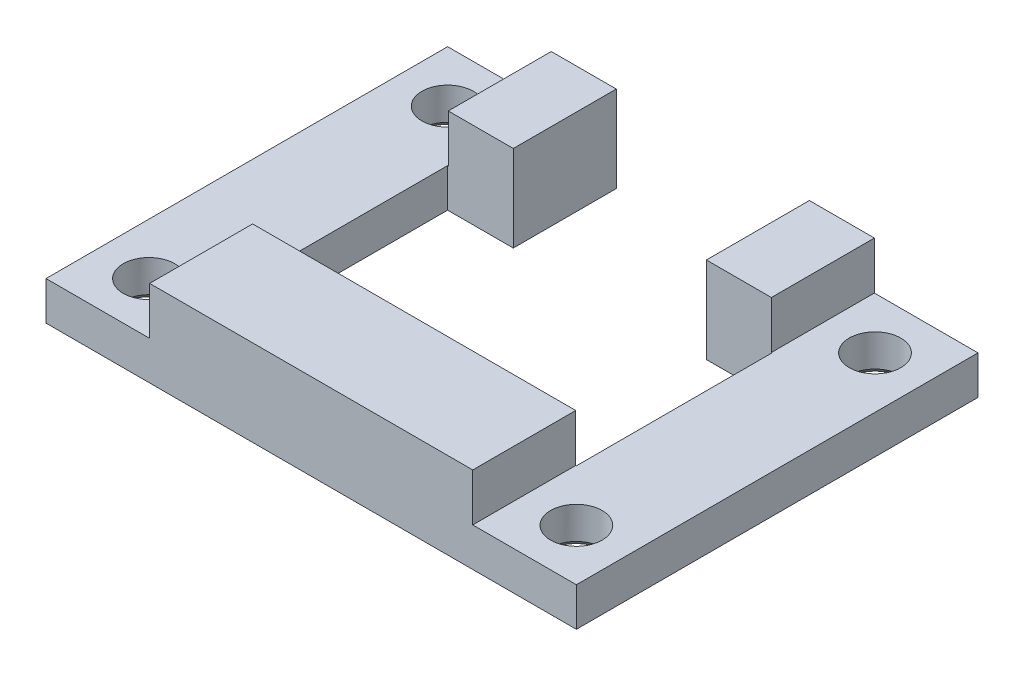
ISO-10303-21;
HEADER;
FILE_DESCRIPTION(('STEP AP214'),'2;1');
FILE_NAME('part.step','',(''),(''),'','','');
FILE_SCHEMA(('AUTOMOTIVE_DESIGN { 1 0 10303 214 1 1 1 1 }'));
ENDSEC;
DATA;
#1=APPLICATION_CONTEXT('core data for automotive mechanical design processes');
#2=APPLICATION_PROTOCOL_DEFINITION('international standard','automotive_design',2000,#1);
#3=PRODUCT_CONTEXT('',#1,'mechanical');
#4=PRODUCT('Part','Part','',(#3));
#5=PRODUCT_RELATED_PRODUCT_CATEGORY('part','',(#4));
#6=PRODUCT_DEFINITION_FORMATION('','',#4);
#7=PRODUCT_DEFINITION_CONTEXT('part definition',#1,'design');
#8=PRODUCT_DEFINITION('design','',#6,#7);
#9=PRODUCT_DEFINITION_SHAPE('','',#8);
#10=(LENGTH_UNIT() NAMED_UNIT(*) SI_UNIT(.MILLI.,.METRE.));
#11=(NAMED_UNIT(*) PLANE_ANGLE_UNIT() SI_UNIT($,.RADIAN.));
#12=(NAMED_UNIT(*) SI_UNIT($,.STERADIAN.) SOLID_ANGLE_UNIT());
#13=UNCERTAINTY_MEASURE_WITH_UNIT(LENGTH_MEASURE(1.E-05),#10,'distance_accuracy_value','');
#14=(GEOMETRIC_REPRESENTATION_CONTEXT(3) GLOBAL_UNCERTAINTY_ASSIGNED_CONTEXT((#13)) GLOBAL_UNIT_ASSIGNED_CONTEXT((#10,
#11,#12)) REPRESENTATION_CONTEXT('',''));
#15=CARTESIAN_POINT('',(0.,0.,0.));
#16=DIRECTION('',(0.,0.,1.));
#17=DIRECTION('',(1.,0.,0.));
#18=AXIS2_PLACEMENT_3D('',#15,#16,#17);
#19=CARTESIAN_POINT('',(-20.6,3.,-15.6));
#20=DIRECTION('',(0.,0.,1.));
#21=DIRECTION('',(1.,0.,0.));
#22=AXIS2_PLACEMENT_3D('',#19,#20,#21);
#23=PLANE('',#22);
#24=DIRECTION('',(-1.,0.,0.));
#25=VECTOR('',#24,1.);
#26=CARTESIAN_POINT('',(12.55,6.7,-15.6));
#27=LINE('',#26,#25);
#28=CARTESIAN_POINT('',(-7.5,6.7,-15.6));
#29=VERTEX_POINT('',#28);
#30=CARTESIAN_POINT('',(-12.55,6.7,-15.6));
#31=VERTEX_POINT('',#30);
#32=EDGE_CURVE('E201',#29,#31,#27,.T.);
#33=ORIENTED_EDGE('',*,*,#32,.F.);
#34=DIRECTION('',(0.,-1.,0.));
#35=VECTOR('',#34,1.);
#36=CARTESIAN_POINT('',(-7.5,40.9531750353161,-15.6));
#37=LINE('',#36,#35);
#38=CARTESIAN_POINT('',(-7.5,0.,-15.6));
#39=VERTEX_POINT('',#38);
#40=EDGE_CURVE('E184',#29,#39,#37,.T.);
#41=ORIENTED_EDGE('',*,*,#40,.T.);
#42=DIRECTION('',(-1.,0.,0.));
#43=VECTOR('',#42,1.);
#44=CARTESIAN_POINT('',(-20.6,0.,-15.6));
#45=LINE('',#44,#43);
#46=CARTESIAN_POINT('',(-20.6,0.,-15.6));
#47=VERTEX_POINT('',#46);
#48=EDGE_CURVE('E198',#39,#47,#45,.T.);
#49=ORIENTED_EDGE('',*,*,#48,.T.);
#50=DIRECTION('',(0.,-1.,0.));
#51=VECTOR('',#50,1.);
#52=CARTESIAN_POINT('',(-20.6,3.,-15.6));
#53=LINE('',#52,#51);
#54=CARTESIAN_POINT('',(-20.6,3.,-15.6));
#55=VERTEX_POINT('',#54);
#56=EDGE_CURVE('E237',#55,#47,#53,.T.);
#57=ORIENTED_EDGE('',*,*,#56,.F.);
#58=DIRECTION('',(-1.,0.,0.));
#59=VECTOR('',#58,1.);
#60=CARTESIAN_POINT('',(-20.6,3.,-15.6));
#61=LINE('',#60,#59);
#62=CARTESIAN_POINT('',(-12.55,3.,-15.6));
#63=VERTEX_POINT('',#62);
#64=EDGE_CURVE('E471',#63,#55,#61,.T.);
#65=ORIENTED_EDGE('',*,*,#64,.F.);
#66=DIRECTION('',(0.,-1.,0.));
#67=VECTOR('',#66,1.);
#68=CARTESIAN_POINT('',(-12.55,6.7,-15.6));
#69=LINE('',#68,#67);
#70=EDGE_CURVE('E461',#31,#63,#69,.T.);
#71=ORIENTED_EDGE('',*,*,#70,.F.);
#72=EDGE_LOOP('',(#33,#41,#49,#57,#65,#71));
#73=FACE_BOUND('',#72,.T.);
#74=ADVANCED_FACE('F42',(#73),#23,.F.);
#75=CARTESIAN_POINT('',(12.55,6.7,-15.6));
#76=DIRECTION('',(-1.,0.,0.));
#77=DIRECTION('',(0.,0.,1.));
#78=AXIS2_PLACEMENT_3D('',#75,#76,#77);
#79=PLANE('',#78);
#80=DIRECTION('',(0.,0.,-1.));
#81=VECTOR('',#80,1.);
#82=CARTESIAN_POINT('',(12.55,3.,-15.6));
#83=LINE('',#82,#81);
#84=CARTESIAN_POINT('',(12.55,3.,15.6));
#85=VERTEX_POINT('',#84);
#86=CARTESIAN_POINT('',(12.55,3.,7.6));
#87=VERTEX_POINT('',#86);
#88=EDGE_CURVE('E67',#85,#87,#83,.T.);
#89=ORIENTED_EDGE('',*,*,#88,.T.);
#90=DIRECTION('',(0.,1.,0.));
#91=VECTOR('',#90,1.);
#92=CARTESIAN_POINT('',(12.55,6.7,7.6));
#93=LINE('',#92,#91);
#94=CARTESIAN_POINT('',(12.55,6.7,7.6));
#95=VERTEX_POINT('',#94);
#96=EDGE_CURVE('E390',#87,#95,#93,.T.);
#97=ORIENTED_EDGE('',*,*,#96,.T.);
#98=DIRECTION('',(0.,0.,-1.));
#99=VECTOR('',#98,1.);
#100=CARTESIAN_POINT('',(12.55,6.7,-15.6));
#101=LINE('',#100,#99);
#102=CARTESIAN_POINT('',(12.55,6.7,15.6));
#103=VERTEX_POINT('',#102);
#104=EDGE_CURVE('E430',#103,#95,#101,.T.);
#105=ORIENTED_EDGE('',*,*,#104,.F.);
#106=DIRECTION('',(0.,-1.,0.));
#107=VECTOR('',#106,1.);
#108=CARTESIAN_POINT('',(12.55,6.7,15.6));
#109=LINE('',#108,#107);
#110=EDGE_CURVE('E446',#103,#85,#109,.T.);
#111=ORIENTED_EDGE('',*,*,#110,.T.);
#112=EDGE_LOOP('',(#89,#97,#105,#111));
#113=FACE_BOUND('',#112,.T.);
#114=ADVANCED_FACE('F302',(#113),#79,.F.);
#115=CARTESIAN_POINT('',(-12.55,6.7,-15.6));
#116=DIRECTION('',(1.,0.,0.));
#117=DIRECTION('',(0.,0.,-1.));
#118=AXIS2_PLACEMENT_3D('',#115,#116,#117);
#119=PLANE('',#118);
#120=DIRECTION('',(0.,0.,1.));
#121=VECTOR('',#120,1.);
#122=CARTESIAN_POINT('',(-12.55,3.,-15.6));
#123=LINE('',#122,#121);
#124=CARTESIAN_POINT('',(-12.55,3.,-7.6));
#125=VERTEX_POINT('',#124);
#126=EDGE_CURVE('E450',#63,#125,#123,.T.);
#127=ORIENTED_EDGE('',*,*,#126,.T.);
#128=DIRECTION('',(0.,1.,0.));
#129=VECTOR('',#128,1.);
#130=CARTESIAN_POINT('',(-12.55,6.7,-7.6));
#131=LINE('',#130,#129);
#132=CARTESIAN_POINT('',(-12.55,6.7,-7.6));
#133=VERTEX_POINT('',#132);
#134=EDGE_CURVE('E397',#125,#133,#131,.T.);
#135=ORIENTED_EDGE('',*,*,#134,.T.);
#136=DIRECTION('',(0.,0.,1.));
#137=VECTOR('',#136,1.);
#138=CARTESIAN_POINT('',(-12.55,6.7,-15.6));
#139=LINE('',#138,#137);
#140=EDGE_CURVE('E439',#31,#133,#139,.T.);
#141=ORIENTED_EDGE('',*,*,#140,.F.);
#142=ORIENTED_EDGE('',*,*,#70,.T.);
#143=EDGE_LOOP('',(#127,#135,#141,#142));
#144=FACE_BOUND('',#143,.T.);
#145=ADVANCED_FACE('F308',(#144),#119,.F.);
#146=CARTESIAN_POINT('',(0.,6.7,0.));
#147=DIRECTION('',(0.,-1.,0.));
#148=DIRECTION('',(0.,0.,-1.));
#149=AXIS2_PLACEMENT_3D('',#146,#147,#148);
#150=PLANE('',#149);
#151=DIRECTION('',(-1.,0.,0.));
#152=VECTOR('',#151,1.);
#153=CARTESIAN_POINT('',(-12.6,6.7,-7.6));
#154=LINE('',#153,#152);
#155=CARTESIAN_POINT('',(-7.5,6.7,-7.6));
#156=VERTEX_POINT('',#155);
#157=EDGE_CURVE('E499',#156,#133,#154,.T.);
#158=ORIENTED_EDGE('',*,*,#157,.F.);
#159=DIRECTION('',(0.,0.,1.));
#160=VECTOR('',#159,1.);
#161=CARTESIAN_POINT('',(-7.5,6.7,-15.6));
#162=LINE('',#161,#160);
#163=EDGE_CURVE('E378',#29,#156,#162,.T.);
#164=ORIENTED_EDGE('',*,*,#163,.F.);
#165=ORIENTED_EDGE('',*,*,#32,.T.);
#166=ORIENTED_EDGE('',*,*,#140,.T.);
#167=EDGE_LOOP('',(#158,#164,#165,#166));
#168=FACE_BOUND('',#167,.T.);
#169=ADVANCED_FACE('F498',(#168),#150,.F.);
#170=ORIENTED_EDGE('',*,*,#104,.T.);
#171=DIRECTION('',(-1.,0.,0.));
#172=VECTOR('',#171,1.);
#173=CARTESIAN_POINT('',(0.,6.7,7.6));
#174=LINE('',#173,#172);
#175=CARTESIAN_POINT('',(-12.55,6.7,7.6));
#176=VERTEX_POINT('',#175);
#177=EDGE_CURVE('E248',#95,#176,#174,.T.);
#178=ORIENTED_EDGE('',*,*,#177,.T.);
#179=CARTESIAN_POINT('',(-12.55,6.7,15.6));
#180=VERTEX_POINT('',#179);
#181=EDGE_CURVE('E438',#176,#180,#139,.T.);
#182=ORIENTED_EDGE('',*,*,#181,.T.);
#183=DIRECTION('',(1.,0.,0.));
#184=VECTOR('',#183,1.);
#185=CARTESIAN_POINT('',(12.55,6.7,15.6));
#186=LINE('',#185,#184);
#187=EDGE_CURVE('E443',#180,#103,#186,.T.);
#188=ORIENTED_EDGE('',*,*,#187,.T.);
#189=EDGE_LOOP('',(#170,#178,#182,#188));
#190=FACE_BOUND('',#189,.T.);
#191=ADVANCED_FACE('F533',(#190),#150,.F.);
#192=CARTESIAN_POINT('',(0.,3.,0.));
#193=DIRECTION('',(0.,-1.,0.));
#194=DIRECTION('',(0.,0.,-1.));
#195=AXIS2_PLACEMENT_3D('',#192,#193,#194);
#196=PLANE('',#195);
#197=CARTESIAN_POINT('',(16.6,3.,-11.6));
#198=DIRECTION('',(0.,1.,0.));
#199=DIRECTION('',(0.,0.,1.));
#200=AXIS2_PLACEMENT_3D('',#197,#198,#199);
#201=CIRCLE('',#200,2.);
#202=CARTESIAN_POINT('',(16.6,3.,-9.6));
#203=VERTEX_POINT('',#202);
#204=EDGE_CURVE('E413',#203,#203,#201,.T.);
#205=ORIENTED_EDGE('',*,*,#204,.F.);
#206=EDGE_LOOP('',(#205));
#207=FACE_BOUND('',#206,.T.);
#208=CARTESIAN_POINT('',(16.6,3.,11.6));
#209=DIRECTION('',(0.,1.,0.));
#210=DIRECTION('',(0.,0.,1.));
#211=AXIS2_PLACEMENT_3D('',#208,#209,#210);
#212=CIRCLE('',#211,2.);
#213=CARTESIAN_POINT('',(16.6,3.,13.6));
#214=VERTEX_POINT('',#213);
#215=EDGE_CURVE('E418',#214,#214,#212,.T.);
#216=ORIENTED_EDGE('',*,*,#215,.F.);
#217=EDGE_LOOP('',(#216));
#218=FACE_BOUND('',#217,.T.);
#219=DIRECTION('',(0.,0.,1.));
#220=VECTOR('',#219,1.);
#221=CARTESIAN_POINT('',(12.6,3.,0.));
#222=LINE('',#221,#220);
#223=CARTESIAN_POINT('',(12.6,3.,-7.6));
#224=VERTEX_POINT('',#223);
#225=CARTESIAN_POINT('',(12.6,3.,7.6));
#226=VERTEX_POINT('',#225);
#227=EDGE_CURVE('E405',#224,#226,#222,.T.);
#228=ORIENTED_EDGE('',*,*,#227,.T.);
#229=DIRECTION('',(-1.,0.,0.));
#230=VECTOR('',#229,1.);
#231=CARTESIAN_POINT('',(0.,3.,7.6));
#232=LINE('',#231,#230);
#233=EDGE_CURVE('E394',#226,#87,#232,.T.);
#234=ORIENTED_EDGE('',*,*,#233,.T.);
#235=ORIENTED_EDGE('',*,*,#88,.F.);
#236=DIRECTION('',(1.,0.,0.));
#237=VECTOR('',#236,1.);
#238=CARTESIAN_POINT('',(-20.6,3.,15.6));
#239=LINE('',#238,#237);
#240=CARTESIAN_POINT('',(20.6,3.,15.6));
#241=VERTEX_POINT('',#240);
#242=EDGE_CURVE('E478',#85,#241,#239,.T.);
#243=ORIENTED_EDGE('',*,*,#242,.T.);
#244=DIRECTION('',(0.,0.,-1.));
#245=VECTOR('',#244,1.);
#246=CARTESIAN_POINT('',(20.6,3.,15.6));
#247=LINE('',#246,#245);
#248=CARTESIAN_POINT('',(20.6,3.,-15.6));
#249=VERTEX_POINT('',#248);
#250=EDGE_CURVE('E227',#241,#249,#247,.T.);
#251=ORIENTED_EDGE('',*,*,#250,.T.);
#252=CARTESIAN_POINT('',(12.55,3.,-15.6));
#253=VERTEX_POINT('',#252);
#254=EDGE_CURVE('E472',#249,#253,#61,.T.);
#255=ORIENTED_EDGE('',*,*,#254,.T.);
#256=CARTESIAN_POINT('',(12.55,3.,-7.6));
#257=VERTEX_POINT('',#256);
#258=EDGE_CURVE('E429',#257,#253,#83,.T.);
#259=ORIENTED_EDGE('',*,*,#258,.F.);
#260=DIRECTION('',(1.,0.,0.));
#261=VECTOR('',#260,1.);
#262=CARTESIAN_POINT('',(0.,3.,-7.6));
#263=LINE('',#262,#261);
#264=EDGE_CURVE('E377',#257,#224,#263,.T.);
#265=ORIENTED_EDGE('',*,*,#264,.T.);
#266=EDGE_LOOP('',(#228,#234,#235,#243,#251,#255,#259,#265));
#267=FACE_BOUND('',#266,.T.);
#268=ADVANCED_FACE('F486',(#207,#218,#267),#196,.F.);
#269=CARTESIAN_POINT('',(-16.6,3.,11.6));
#270=DIRECTION('',(0.,1.,0.));
#271=DIRECTION('',(0.,0.,1.));
#272=AXIS2_PLACEMENT_3D('',#269,#270,#271);
#273=CIRCLE('',#272,2.);
#274=CARTESIAN_POINT('',(-16.6,3.,13.6));
#275=VERTEX_POINT('',#274);
#276=EDGE_CURVE('E419',#275,#275,#273,.T.);
#277=ORIENTED_EDGE('',*,*,#276,.F.);
#278=EDGE_LOOP('',(#277));
#279=FACE_BOUND('',#278,.T.);
#280=CARTESIAN_POINT('',(-16.6,3.,-11.6));
#281=DIRECTION('',(0.,1.,0.));
#282=DIRECTION('',(0.,0.,1.));
#283=AXIS2_PLACEMENT_3D('',#280,#281,#282);
#284=CIRCLE('',#283,2.);
#285=CARTESIAN_POINT('',(-16.6,3.,-9.6));
#286=VERTEX_POINT('',#285);
#287=EDGE_CURVE('E414',#286,#286,#284,.T.);
#288=ORIENTED_EDGE('',*,*,#287,.F.);
#289=EDGE_LOOP('',(#288));
#290=FACE_BOUND('',#289,.T.);
#291=DIRECTION('',(0.,0.,-1.));
#292=VECTOR('',#291,1.);
#293=CARTESIAN_POINT('',(-12.6,3.,0.));
#294=LINE('',#293,#292);
#295=CARTESIAN_POINT('',(-12.6,3.,7.6));
#296=VERTEX_POINT('',#295);
#297=CARTESIAN_POINT('',(-12.6,3.,-7.6));
#298=VERTEX_POINT('',#297);
#299=EDGE_CURVE('E409',#296,#298,#294,.T.);
#300=ORIENTED_EDGE('',*,*,#299,.T.);
#301=DIRECTION('',(1.,0.,0.));
#302=VECTOR('',#301,1.);
#303=CARTESIAN_POINT('',(0.,3.,-7.6));
#304=LINE('',#303,#302);
#305=EDGE_CURVE('E401',#298,#125,#304,.T.);
#306=ORIENTED_EDGE('',*,*,#305,.T.);
#307=ORIENTED_EDGE('',*,*,#126,.F.);
#308=ORIENTED_EDGE('',*,*,#64,.T.);
#309=DIRECTION('',(0.,0.,1.));
#310=VECTOR('',#309,1.);
#311=CARTESIAN_POINT('',(-20.6,3.,15.6));
#312=LINE('',#311,#310);
#313=CARTESIAN_POINT('',(-20.6,3.,15.6));
#314=VERTEX_POINT('',#313);
#315=EDGE_CURVE('E476',#55,#314,#312,.T.);
#316=ORIENTED_EDGE('',*,*,#315,.T.);
#317=CARTESIAN_POINT('',(-12.55,3.,15.6));
#318=VERTEX_POINT('',#317);
#319=EDGE_CURVE('E233',#314,#318,#239,.T.);
#320=ORIENTED_EDGE('',*,*,#319,.T.);
#321=CARTESIAN_POINT('',(-12.55,3.,7.6));
#322=VERTEX_POINT('',#321);
#323=EDGE_CURVE('E449',#322,#318,#123,.T.);
#324=ORIENTED_EDGE('',*,*,#323,.F.);
#325=DIRECTION('',(-1.,0.,0.));
#326=VECTOR('',#325,1.);
#327=CARTESIAN_POINT('',(0.,3.,7.6));
#328=LINE('',#327,#326);
#329=EDGE_CURVE('E386',#322,#296,#328,.T.);
#330=ORIENTED_EDGE('',*,*,#329,.T.);
#331=EDGE_LOOP('',(#300,#306,#307,#308,#316,#320,#324,#330));
#332=FACE_BOUND('',#331,.T.);
#333=ADVANCED_FACE('F322',(#279,#290,#332),#196,.F.);
#334=CARTESIAN_POINT('',(20.6,3.,15.6));
#335=DIRECTION('',(-1.,0.,0.));
#336=DIRECTION('',(0.,0.,1.));
#337=AXIS2_PLACEMENT_3D('',#334,#335,#336);
#338=PLANE('',#337);
#339=DIRECTION('',(0.,0.,-1.));
#340=VECTOR('',#339,1.);
#341=CARTESIAN_POINT('',(20.6,0.,15.6));
#342=LINE('',#341,#340);
#343=CARTESIAN_POINT('',(20.6,0.,15.6));
#344=VERTEX_POINT('',#343);
#345=CARTESIAN_POINT('',(20.6,0.,-15.6));
#346=VERTEX_POINT('',#345);
#347=EDGE_CURVE('E212',#344,#346,#342,.T.);
#348=ORIENTED_EDGE('',*,*,#347,.T.);
#349=DIRECTION('',(0.,-1.,0.));
#350=VECTOR('',#349,1.);
#351=CARTESIAN_POINT('',(20.6,3.,-15.6));
#352=LINE('',#351,#350);
#353=EDGE_CURVE('E240',#249,#346,#352,.T.);
#354=ORIENTED_EDGE('',*,*,#353,.F.);
#355=ORIENTED_EDGE('',*,*,#250,.F.);
#356=DIRECTION('',(0.,-1.,0.));
#357=VECTOR('',#356,1.);
#358=CARTESIAN_POINT('',(20.6,3.,15.6));
#359=LINE('',#358,#357);
#360=EDGE_CURVE('E228',#241,#344,#359,.T.);
#361=ORIENTED_EDGE('',*,*,#360,.T.);
#362=EDGE_LOOP('',(#348,#354,#355,#361));
#363=FACE_BOUND('',#362,.T.);
#364=ADVANCED_FACE('F315',(#363),#338,.F.);
#365=CARTESIAN_POINT('',(7.5,0.,-15.6));
#366=VERTEX_POINT('',#365);
#367=EDGE_CURVE('E211',#346,#366,#45,.T.);
#368=ORIENTED_EDGE('',*,*,#367,.T.);
#369=DIRECTION('',(0.,-1.,0.));
#370=VECTOR('',#369,1.);
#371=CARTESIAN_POINT('',(7.5,40.9531750353161,-15.6));
#372=LINE('',#371,#370);
#373=CARTESIAN_POINT('',(7.5,6.7,-15.6));
#374=VERTEX_POINT('',#373);
#375=EDGE_CURVE('E203',#374,#366,#372,.T.);
#376=ORIENTED_EDGE('',*,*,#375,.F.);
#377=CARTESIAN_POINT('',(12.55,6.7,-15.6));
#378=VERTEX_POINT('',#377);
#379=EDGE_CURVE('E435',#378,#374,#27,.T.);
#380=ORIENTED_EDGE('',*,*,#379,.F.);
#381=DIRECTION('',(0.,-1.,0.));
#382=VECTOR('',#381,1.);
#383=CARTESIAN_POINT('',(12.55,6.7,-15.6));
#384=LINE('',#383,#382);
#385=EDGE_CURVE('E218',#378,#253,#384,.T.);
#386=ORIENTED_EDGE('',*,*,#385,.T.);
#387=ORIENTED_EDGE('',*,*,#254,.F.);
#388=ORIENTED_EDGE('',*,*,#353,.T.);
#389=EDGE_LOOP('',(#368,#376,#380,#386,#387,#388));
#390=FACE_BOUND('',#389,.T.);
#391=ADVANCED_FACE('F304',(#390),#23,.F.);
#392=CARTESIAN_POINT('',(-20.6,3.,15.6));
#393=DIRECTION('',(1.,0.,0.));
#394=DIRECTION('',(0.,0.,-1.));
#395=AXIS2_PLACEMENT_3D('',#392,#393,#394);
#396=PLANE('',#395);
#397=DIRECTION('',(0.,0.,1.));
#398=VECTOR('',#397,1.);
#399=CARTESIAN_POINT('',(-20.6,0.,15.6));
#400=LINE('',#399,#398);
#401=CARTESIAN_POINT('',(-20.6,0.,15.6));
#402=VERTEX_POINT('',#401);
#403=EDGE_CURVE('E209',#47,#402,#400,.T.);
#404=ORIENTED_EDGE('',*,*,#403,.T.);
#405=DIRECTION('',(0.,-1.,0.));
#406=VECTOR('',#405,1.);
#407=CARTESIAN_POINT('',(-20.6,3.,15.6));
#408=LINE('',#407,#406);
#409=EDGE_CURVE('E232',#314,#402,#408,.T.);
#410=ORIENTED_EDGE('',*,*,#409,.F.);
#411=ORIENTED_EDGE('',*,*,#315,.F.);
#412=ORIENTED_EDGE('',*,*,#56,.T.);
#413=EDGE_LOOP('',(#404,#410,#411,#412));
#414=FACE_BOUND('',#413,.T.);
#415=ADVANCED_FACE('F314',(#414),#396,.F.);
#416=CARTESIAN_POINT('',(-20.6,3.,15.6));
#417=DIRECTION('',(0.,0.,-1.));
#418=DIRECTION('',(-1.,0.,0.));
#419=AXIS2_PLACEMENT_3D('',#416,#417,#418);
#420=PLANE('',#419);
#421=DIRECTION('',(1.,0.,0.));
#422=VECTOR('',#421,1.);
#423=CARTESIAN_POINT('',(-20.6,0.,15.6));
#424=LINE('',#423,#422);
#425=EDGE_CURVE('E224',#402,#344,#424,.T.);
#426=ORIENTED_EDGE('',*,*,#425,.T.);
#427=ORIENTED_EDGE('',*,*,#360,.F.);
#428=ORIENTED_EDGE('',*,*,#242,.F.);
#429=ORIENTED_EDGE('',*,*,#110,.F.);
#430=ORIENTED_EDGE('',*,*,#187,.F.);
#431=DIRECTION('',(0.,-1.,0.));
#432=VECTOR('',#431,1.);
#433=CARTESIAN_POINT('',(-12.55,6.7,15.6));
#434=LINE('',#433,#432);
#435=EDGE_CURVE('E457',#180,#318,#434,.T.);
#436=ORIENTED_EDGE('',*,*,#435,.T.);
#437=ORIENTED_EDGE('',*,*,#319,.F.);
#438=ORIENTED_EDGE('',*,*,#409,.T.);
#439=EDGE_LOOP('',(#426,#427,#428,#429,#430,#436,#437,#438));
#440=FACE_BOUND('',#439,.T.);
#441=ADVANCED_FACE('F291',(#440),#420,.F.);
#442=CARTESIAN_POINT('',(0.,0.,0.));
#443=DIRECTION('',(0.,-1.,0.));
#444=DIRECTION('',(0.,0.,-1.));
#445=AXIS2_PLACEMENT_3D('',#442,#443,#444);
#446=PLANE('',#445);
#447=CARTESIAN_POINT('',(-16.6,0.,-11.6));
#448=DIRECTION('',(0.,-1.,0.));
#449=DIRECTION('',(0.,0.,-1.));
#450=AXIS2_PLACEMENT_3D('',#447,#448,#449);
#451=CIRCLE('',#450,2.5);
#452=CARTESIAN_POINT('',(-16.6,0.,-14.1));
#453=VERTEX_POINT('',#452);
#454=EDGE_CURVE('E264',#453,#453,#451,.F.);
#455=ORIENTED_EDGE('',*,*,#454,.T.);
#456=EDGE_LOOP('',(#455));
#457=FACE_BOUND('',#456,.T.);
#458=CARTESIAN_POINT('',(16.6,0.,-11.6));
#459=DIRECTION('',(0.,-1.,0.));
#460=DIRECTION('',(0.,0.,-1.));
#461=AXIS2_PLACEMENT_3D('',#458,#459,#460);
#462=CIRCLE('',#461,2.5);
#463=CARTESIAN_POINT('',(16.6,0.,-14.1));
#464=VERTEX_POINT('',#463);
#465=EDGE_CURVE('E260',#464,#464,#462,.F.);
#466=ORIENTED_EDGE('',*,*,#465,.T.);
#467=EDGE_LOOP('',(#466));
#468=FACE_BOUND('',#467,.T.);
#469=CARTESIAN_POINT('',(16.6,0.,11.6));
#470=DIRECTION('',(0.,-1.,0.));
#471=DIRECTION('',(0.,0.,-1.));
#472=AXIS2_PLACEMENT_3D('',#469,#470,#471);
#473=CIRCLE('',#472,2.5);
#474=CARTESIAN_POINT('',(16.6,0.,9.1));
#475=VERTEX_POINT('',#474);
#476=EDGE_CURVE('E256',#475,#475,#473,.F.);
#477=ORIENTED_EDGE('',*,*,#476,.T.);
#478=EDGE_LOOP('',(#477));
#479=FACE_BOUND('',#478,.T.);
#480=CARTESIAN_POINT('',(-16.6,0.,11.6));
#481=DIRECTION('',(0.,-1.,0.));
#482=DIRECTION('',(0.,0.,-1.));
#483=AXIS2_PLACEMENT_3D('',#480,#481,#482);
#484=CIRCLE('',#483,2.5);
#485=CARTESIAN_POINT('',(-16.6,0.,9.1));
#486=VERTEX_POINT('',#485);
#487=EDGE_CURVE('E252',#486,#486,#484,.F.);
#488=ORIENTED_EDGE('',*,*,#487,.T.);
#489=EDGE_LOOP('',(#488));
#490=FACE_BOUND('',#489,.T.);
#491=DIRECTION('',(0.,0.,-1.));
#492=VECTOR('',#491,1.);
#493=CARTESIAN_POINT('',(-7.5,0.,-15.6));
#494=LINE('',#493,#492);
#495=CARTESIAN_POINT('',(-7.5,0.,-7.6));
#496=VERTEX_POINT('',#495);
#497=EDGE_CURVE('E181',#496,#39,#494,.T.);
#498=ORIENTED_EDGE('',*,*,#497,.F.);
#499=DIRECTION('',(1.,0.,0.));
#500=VECTOR('',#499,1.);
#501=CARTESIAN_POINT('',(-12.6,0.,-7.6));
#502=LINE('',#501,#500);
#503=CARTESIAN_POINT('',(-12.6,0.,-7.6));
#504=VERTEX_POINT('',#503);
#505=EDGE_CURVE('E204',#504,#496,#502,.T.);
#506=ORIENTED_EDGE('',*,*,#505,.F.);
#507=DIRECTION('',(0.,0.,-1.));
#508=VECTOR('',#507,1.);
#509=CARTESIAN_POINT('',(-12.6,0.,7.6));
#510=LINE('',#509,#508);
#511=CARTESIAN_POINT('',(-12.6,0.,7.6));
#512=VERTEX_POINT('',#511);
#513=EDGE_CURVE('E348',#512,#504,#510,.T.);
#514=ORIENTED_EDGE('',*,*,#513,.F.);
#515=DIRECTION('',(-1.,0.,0.));
#516=VECTOR('',#515,1.);
#517=CARTESIAN_POINT('',(-12.6,0.,7.6));
#518=LINE('',#517,#516);
#519=CARTESIAN_POINT('',(12.6,0.,7.6));
#520=VERTEX_POINT('',#519);
#521=EDGE_CURVE('E344',#520,#512,#518,.T.);
#522=ORIENTED_EDGE('',*,*,#521,.F.);
#523=DIRECTION('',(0.,0.,1.));
#524=VECTOR('',#523,1.);
#525=CARTESIAN_POINT('',(12.6,0.,7.6));
#526=LINE('',#525,#524);
#527=CARTESIAN_POINT('',(12.6,0.,-7.6));
#528=VERTEX_POINT('',#527);
#529=EDGE_CURVE('E337',#528,#520,#526,.T.);
#530=ORIENTED_EDGE('',*,*,#529,.F.);
#531=DIRECTION('',(1.,0.,0.));
#532=VECTOR('',#531,1.);
#533=CARTESIAN_POINT('',(7.49999999999999,0.,-7.6));
#534=LINE('',#533,#532);
#535=CARTESIAN_POINT('',(7.49999999999999,0.,-7.6));
#536=VERTEX_POINT('',#535);
#537=EDGE_CURVE('E333',#536,#528,#534,.T.);
#538=ORIENTED_EDGE('',*,*,#537,.F.);
#539=DIRECTION('',(0.,0.,1.));
#540=VECTOR('',#539,1.);
#541=CARTESIAN_POINT('',(7.5,0.,-15.6));
#542=LINE('',#541,#540);
#543=EDGE_CURVE('E193',#366,#536,#542,.T.);
#544=ORIENTED_EDGE('',*,*,#543,.F.);
#545=ORIENTED_EDGE('',*,*,#367,.F.);
#546=ORIENTED_EDGE('',*,*,#347,.F.);
#547=ORIENTED_EDGE('',*,*,#425,.F.);
#548=ORIENTED_EDGE('',*,*,#403,.F.);
#549=ORIENTED_EDGE('',*,*,#48,.F.);
#550=EDGE_LOOP('',(#498,#506,#514,#522,#530,#538,#544,#545,#546,#547,#548,#549));
#551=FACE_BOUND('',#550,.T.);
#552=ADVANCED_FACE('F207',(#457,#468,#479,#490,#551),#446,.T.);
#553=CARTESIAN_POINT('',(12.55,6.7,-7.6));
#554=VERTEX_POINT('',#553);
#555=EDGE_CURVE('E434',#554,#378,#101,.T.);
#556=ORIENTED_EDGE('',*,*,#555,.F.);
#557=DIRECTION('',(0.,-1.,0.));
#558=VECTOR('',#557,1.);
#559=CARTESIAN_POINT('',(12.55,6.7,-7.6));
#560=LINE('',#559,#558);
#561=EDGE_CURVE('E373',#554,#257,#560,.T.);
#562=ORIENTED_EDGE('',*,*,#561,.T.);
#563=ORIENTED_EDGE('',*,*,#258,.T.);
#564=ORIENTED_EDGE('',*,*,#385,.F.);
#565=EDGE_LOOP('',(#556,#562,#563,#564));
#566=FACE_BOUND('',#565,.T.);
#567=ADVANCED_FACE('F290',(#566),#79,.F.);
#568=ORIENTED_EDGE('',*,*,#181,.F.);
#569=DIRECTION('',(0.,-1.,0.));
#570=VECTOR('',#569,1.);
#571=CARTESIAN_POINT('',(-12.55,6.7,7.6));
#572=LINE('',#571,#570);
#573=EDGE_CURVE('E382',#176,#322,#572,.T.);
#574=ORIENTED_EDGE('',*,*,#573,.T.);
#575=ORIENTED_EDGE('',*,*,#323,.T.);
#576=ORIENTED_EDGE('',*,*,#435,.F.);
#577=EDGE_LOOP('',(#568,#574,#575,#576));
#578=FACE_BOUND('',#577,.T.);
#579=ADVANCED_FACE('F536',(#578),#119,.F.);
#580=DIRECTION('',(0.,0.,-1.));
#581=VECTOR('',#580,1.);
#582=CARTESIAN_POINT('',(7.5,6.7,-15.6));
#583=LINE('',#582,#581);
#584=CARTESIAN_POINT('',(7.49999999999999,6.7,-7.6));
#585=VERTEX_POINT('',#584);
#586=EDGE_CURVE('E356',#585,#374,#583,.T.);
#587=ORIENTED_EDGE('',*,*,#586,.F.);
#588=DIRECTION('',(1.,0.,0.));
#589=VECTOR('',#588,1.);
#590=CARTESIAN_POINT('',(0.,6.7,-7.6));
#591=LINE('',#590,#589);
#592=EDGE_CURVE('E244',#585,#554,#591,.T.);
#593=ORIENTED_EDGE('',*,*,#592,.T.);
#594=ORIENTED_EDGE('',*,*,#555,.T.);
#595=ORIENTED_EDGE('',*,*,#379,.T.);
#596=EDGE_LOOP('',(#587,#593,#594,#595));
#597=FACE_BOUND('',#596,.T.);
#598=ADVANCED_FACE('F513',(#597),#150,.F.);
#599=CARTESIAN_POINT('',(16.6,-5.65685424949239,11.6));
#600=DIRECTION('',(0.,1.,0.));
#601=DIRECTION('',(0.,0.,1.));
#602=AXIS2_PLACEMENT_3D('',#599,#600,#601);
#603=CYLINDRICAL_SURFACE('',#602,2.);
#604=CARTESIAN_POINT('',(16.6,0.500000000000003,11.6));
#605=DIRECTION('',(0.,-1.,0.));
#606=DIRECTION('',(0.,0.,-1.));
#607=AXIS2_PLACEMENT_3D('',#604,#605,#606);
#608=CIRCLE('',#607,2.);
#609=CARTESIAN_POINT('',(16.6,0.500000000000003,9.6));
#610=VERTEX_POINT('',#609);
#611=EDGE_CURVE('E52',#610,#610,#608,.T.);
#612=ORIENTED_EDGE('',*,*,#611,.T.);
#613=EDGE_LOOP('',(#612));
#614=FACE_BOUND('',#613,.T.);
#615=ORIENTED_EDGE('',*,*,#215,.T.);
#616=EDGE_LOOP('',(#615));
#617=FACE_BOUND('',#616,.T.);
#618=ADVANCED_FACE('F279',(#614,#617),#603,.F.);
#619=CARTESIAN_POINT('',(-16.6,-5.65685424949239,-11.6));
#620=DIRECTION('',(0.,1.,0.));
#621=DIRECTION('',(0.,0.,1.));
#622=AXIS2_PLACEMENT_3D('',#619,#620,#621);
#623=CYLINDRICAL_SURFACE('',#622,2.);
#624=CARTESIAN_POINT('',(-16.6,0.500000000000001,-11.6));
#625=DIRECTION('',(0.,-1.,0.));
#626=DIRECTION('',(0.,0.,-1.));
#627=AXIS2_PLACEMENT_3D('',#624,#625,#626);
#628=CIRCLE('',#627,2.);
#629=CARTESIAN_POINT('',(-16.6,0.500000000000001,-13.6));
#630=VERTEX_POINT('',#629);
#631=EDGE_CURVE('E268',#630,#630,#628,.T.);
#632=ORIENTED_EDGE('',*,*,#631,.T.);
#633=EDGE_LOOP('',(#632));
#634=FACE_BOUND('',#633,.T.);
#635=ORIENTED_EDGE('',*,*,#287,.T.);
#636=EDGE_LOOP('',(#635));
#637=FACE_BOUND('',#636,.T.);
#638=ADVANCED_FACE('F561',(#634,#637),#623,.F.);
#639=CARTESIAN_POINT('',(-16.6,-5.65685424949239,11.6));
#640=DIRECTION('',(0.,1.,0.));
#641=DIRECTION('',(0.,0.,1.));
#642=AXIS2_PLACEMENT_3D('',#639,#640,#641);
#643=CYLINDRICAL_SURFACE('',#642,2.);
#644=CARTESIAN_POINT('',(-16.6,0.500000000000003,11.6));
#645=DIRECTION('',(0.,-1.,0.));
#646=DIRECTION('',(0.,0.,-1.));
#647=AXIS2_PLACEMENT_3D('',#644,#645,#646);
#648=CIRCLE('',#647,2.);
#649=CARTESIAN_POINT('',(-16.6,0.500000000000003,9.6));
#650=VERTEX_POINT('',#649);
#651=EDGE_CURVE('E11',#650,#650,#648,.T.);
#652=ORIENTED_EDGE('',*,*,#651,.T.);
#653=EDGE_LOOP('',(#652));
#654=FACE_BOUND('',#653,.T.);
#655=ORIENTED_EDGE('',*,*,#276,.T.);
#656=EDGE_LOOP('',(#655));
#657=FACE_BOUND('',#656,.T.);
#658=ADVANCED_FACE('F564',(#654,#657),#643,.F.);
#659=CARTESIAN_POINT('',(16.6,-5.65685424949239,-11.6));
#660=DIRECTION('',(0.,1.,0.));
#661=DIRECTION('',(0.,0.,1.));
#662=AXIS2_PLACEMENT_3D('',#659,#660,#661);
#663=CYLINDRICAL_SURFACE('',#662,2.);
#664=CARTESIAN_POINT('',(16.6,0.5,-11.6));
#665=DIRECTION('',(0.,-1.,0.));
#666=DIRECTION('',(0.,0.,-1.));
#667=AXIS2_PLACEMENT_3D('',#664,#665,#666);
#668=CIRCLE('',#667,2.);
#669=CARTESIAN_POINT('',(16.6,0.5,-13.6));
#670=VERTEX_POINT('',#669);
#671=EDGE_CURVE('E272',#670,#670,#668,.T.);
#672=ORIENTED_EDGE('',*,*,#671,.T.);
#673=EDGE_LOOP('',(#672));
#674=FACE_BOUND('',#673,.T.);
#675=ORIENTED_EDGE('',*,*,#204,.T.);
#676=EDGE_LOOP('',(#675));
#677=FACE_BOUND('',#676,.T.);
#678=ADVANCED_FACE('F552',(#674,#677),#663,.F.);
#679=CARTESIAN_POINT('',(-12.6,40.9531750353161,7.6));
#680=DIRECTION('',(-1.,0.,0.));
#681=DIRECTION('',(0.,0.,1.));
#682=AXIS2_PLACEMENT_3D('',#679,#680,#681);
#683=PLANE('',#682);
#684=DIRECTION('',(0.,-1.,0.));
#685=VECTOR('',#684,1.);
#686=CARTESIAN_POINT('',(-12.6,40.9531750353161,7.6));
#687=LINE('',#686,#685);
#688=EDGE_CURVE('E360',#296,#512,#687,.T.);
#689=ORIENTED_EDGE('',*,*,#688,.T.);
#690=ORIENTED_EDGE('',*,*,#513,.T.);
#691=DIRECTION('',(0.,-1.,0.));
#692=VECTOR('',#691,1.);
#693=CARTESIAN_POINT('',(-12.6,40.9531750353161,-7.6));
#694=LINE('',#693,#692);
#695=EDGE_CURVE('E357',#298,#504,#694,.T.);
#696=ORIENTED_EDGE('',*,*,#695,.F.);
#697=ORIENTED_EDGE('',*,*,#299,.F.);
#698=EDGE_LOOP('',(#689,#690,#696,#697));
#699=FACE_BOUND('',#698,.T.);
#700=ADVANCED_FACE('F538',(#699),#683,.F.);
#701=CARTESIAN_POINT('',(12.6,40.9531750353161,7.6));
#702=DIRECTION('',(1.,0.,0.));
#703=DIRECTION('',(0.,0.,-1.));
#704=AXIS2_PLACEMENT_3D('',#701,#702,#703);
#705=PLANE('',#704);
#706=DIRECTION('',(0.,-1.,0.));
#707=VECTOR('',#706,1.);
#708=CARTESIAN_POINT('',(12.6,40.9531750353161,-7.6));
#709=LINE('',#708,#707);
#710=EDGE_CURVE('E366',#224,#528,#709,.T.);
#711=ORIENTED_EDGE('',*,*,#710,.T.);
#712=ORIENTED_EDGE('',*,*,#529,.T.);
#713=DIRECTION('',(0.,-1.,0.));
#714=VECTOR('',#713,1.);
#715=CARTESIAN_POINT('',(12.6,40.9531750353161,7.6));
#716=LINE('',#715,#714);
#717=EDGE_CURVE('E363',#226,#520,#716,.T.);
#718=ORIENTED_EDGE('',*,*,#717,.F.);
#719=ORIENTED_EDGE('',*,*,#227,.F.);
#720=EDGE_LOOP('',(#711,#712,#718,#719));
#721=FACE_BOUND('',#720,.T.);
#722=ADVANCED_FACE('F522',(#721),#705,.F.);
#723=CARTESIAN_POINT('',(-12.6,40.9531750353161,-7.6));
#724=DIRECTION('',(0.,0.,-1.));
#725=DIRECTION('',(-1.,0.,0.));
#726=AXIS2_PLACEMENT_3D('',#723,#724,#725);
#727=PLANE('',#726);
#728=ORIENTED_EDGE('',*,*,#695,.T.);
#729=ORIENTED_EDGE('',*,*,#505,.T.);
#730=DIRECTION('',(0.,-1.,0.));
#731=VECTOR('',#730,1.);
#732=CARTESIAN_POINT('',(-7.5,40.9531750353161,-7.6));
#733=LINE('',#732,#731);
#734=EDGE_CURVE('E187',#156,#496,#733,.T.);
#735=ORIENTED_EDGE('',*,*,#734,.F.);
#736=ORIENTED_EDGE('',*,*,#157,.T.);
#737=ORIENTED_EDGE('',*,*,#134,.F.);
#738=ORIENTED_EDGE('',*,*,#305,.F.);
#739=EDGE_LOOP('',(#728,#729,#735,#736,#737,#738));
#740=FACE_BOUND('',#739,.T.);
#741=ADVANCED_FACE('F541',(#740),#727,.F.);
#742=CARTESIAN_POINT('',(-12.6,40.9531750353161,7.6));
#743=DIRECTION('',(0.,0.,1.));
#744=DIRECTION('',(1.,0.,0.));
#745=AXIS2_PLACEMENT_3D('',#742,#743,#744);
#746=PLANE('',#745);
#747=ORIENTED_EDGE('',*,*,#717,.T.);
#748=ORIENTED_EDGE('',*,*,#521,.T.);
#749=ORIENTED_EDGE('',*,*,#688,.F.);
#750=ORIENTED_EDGE('',*,*,#329,.F.);
#751=ORIENTED_EDGE('',*,*,#573,.F.);
#752=ORIENTED_EDGE('',*,*,#177,.F.);
#753=ORIENTED_EDGE('',*,*,#96,.F.);
#754=ORIENTED_EDGE('',*,*,#233,.F.);
#755=EDGE_LOOP('',(#747,#748,#749,#750,#751,#752,#753,#754));
#756=FACE_BOUND('',#755,.T.);
#757=ADVANCED_FACE('F526',(#756),#746,.F.);
#758=CARTESIAN_POINT('',(7.49999999999999,40.9531750353161,-7.6));
#759=DIRECTION('',(0.,0.,-1.));
#760=DIRECTION('',(-1.,0.,0.));
#761=AXIS2_PLACEMENT_3D('',#758,#759,#760);
#762=PLANE('',#761);
#763=ORIENTED_EDGE('',*,*,#561,.F.);
#764=ORIENTED_EDGE('',*,*,#592,.F.);
#765=DIRECTION('',(0.,-1.,0.));
#766=VECTOR('',#765,1.);
#767=CARTESIAN_POINT('',(7.49999999999999,40.9531750353161,-7.6));
#768=LINE('',#767,#766);
#769=EDGE_CURVE('E59',#585,#536,#768,.T.);
#770=ORIENTED_EDGE('',*,*,#769,.T.);
#771=ORIENTED_EDGE('',*,*,#537,.T.);
#772=ORIENTED_EDGE('',*,*,#710,.F.);
#773=ORIENTED_EDGE('',*,*,#264,.F.);
#774=EDGE_LOOP('',(#763,#764,#770,#771,#772,#773));
#775=FACE_BOUND('',#774,.T.);
#776=ADVANCED_FACE('F520',(#775),#762,.F.);
#777=CARTESIAN_POINT('',(-7.5,40.9531750353161,-15.6));
#778=DIRECTION('',(-1.,0.,0.));
#779=DIRECTION('',(0.,0.,1.));
#780=AXIS2_PLACEMENT_3D('',#777,#778,#779);
#781=PLANE('',#780);
#782=ORIENTED_EDGE('',*,*,#163,.T.);
#783=ORIENTED_EDGE('',*,*,#734,.T.);
#784=ORIENTED_EDGE('',*,*,#497,.T.);
#785=ORIENTED_EDGE('',*,*,#40,.F.);
#786=EDGE_LOOP('',(#782,#783,#784,#785));
#787=FACE_BOUND('',#786,.T.);
#788=ADVANCED_FACE('F183',(#787),#781,.F.);
#789=CARTESIAN_POINT('',(7.5,40.9531750353161,-15.6));
#790=DIRECTION('',(1.,0.,0.));
#791=DIRECTION('',(0.,0.,-1.));
#792=AXIS2_PLACEMENT_3D('',#789,#790,#791);
#793=PLANE('',#792);
#794=ORIENTED_EDGE('',*,*,#586,.T.);
#795=ORIENTED_EDGE('',*,*,#375,.T.);
#796=ORIENTED_EDGE('',*,*,#543,.T.);
#797=ORIENTED_EDGE('',*,*,#769,.F.);
#798=EDGE_LOOP('',(#794,#795,#796,#797));
#799=FACE_BOUND('',#798,.T.);
#800=ADVANCED_FACE('F511',(#799),#793,.F.);
#801=CARTESIAN_POINT('',(-16.6,0.,-11.6));
#802=DIRECTION('',(0.,-1.,0.));
#803=DIRECTION('',(0.,0.,-1.));
#804=AXIS2_PLACEMENT_3D('',#801,#802,#803);
#805=CONICAL_SURFACE('',#804,2.5,0.785398163397441);
#806=ORIENTED_EDGE('',*,*,#631,.F.);
#807=EDGE_LOOP('',(#806));
#808=FACE_BOUND('',#807,.T.);
#809=ORIENTED_EDGE('',*,*,#454,.F.);
#810=EDGE_LOOP('',(#809));
#811=FACE_BOUND('',#810,.T.);
#812=ADVANCED_FACE('F558',(#808,#811),#805,.F.);
#813=CARTESIAN_POINT('',(16.6,0.,-11.6));
#814=DIRECTION('',(0.,-1.,0.));
#815=DIRECTION('',(0.,0.,-1.));
#816=AXIS2_PLACEMENT_3D('',#813,#814,#815);
#817=CONICAL_SURFACE('',#816,2.5,0.785398163397441);
#818=ORIENTED_EDGE('',*,*,#671,.F.);
#819=EDGE_LOOP('',(#818));
#820=FACE_BOUND('',#819,.T.);
#821=ORIENTED_EDGE('',*,*,#465,.F.);
#822=EDGE_LOOP('',(#821));
#823=FACE_BOUND('',#822,.T.);
#824=ADVANCED_FACE('F285',(#820,#823),#817,.F.);
#825=CARTESIAN_POINT('',(16.6,0.,11.6));
#826=DIRECTION('',(0.,-1.,0.));
#827=DIRECTION('',(0.,0.,-1.));
#828=AXIS2_PLACEMENT_3D('',#825,#826,#827);
#829=CONICAL_SURFACE('',#828,2.5,0.785398163397441);
#830=ORIENTED_EDGE('',*,*,#611,.F.);
#831=EDGE_LOOP('',(#830));
#832=FACE_BOUND('',#831,.T.);
#833=ORIENTED_EDGE('',*,*,#476,.F.);
#834=EDGE_LOOP('',(#833));
#835=FACE_BOUND('',#834,.T.);
#836=ADVANCED_FACE('F282',(#832,#835),#829,.F.);
#837=CARTESIAN_POINT('',(-16.6,0.,11.6));
#838=DIRECTION('',(0.,-1.,0.));
#839=DIRECTION('',(0.,0.,-1.));
#840=AXIS2_PLACEMENT_3D('',#837,#838,#839);
#841=CONICAL_SURFACE('',#840,2.5,0.785398163397441);
#842=ORIENTED_EDGE('',*,*,#651,.F.);
#843=EDGE_LOOP('',(#842));
#844=FACE_BOUND('',#843,.T.);
#845=ORIENTED_EDGE('',*,*,#487,.F.);
#846=EDGE_LOOP('',(#845));
#847=FACE_BOUND('',#846,.T.);
#848=ADVANCED_FACE('F45',(#844,#847),#841,.F.);
#849=CLOSED_SHELL('',(#74,#114,#145,#169,#191,#268,#333,#364,#391,#415,#441,#552,#567,#579,#598,
#618,#638,#658,#678,#700,#722,#741,#757,#776,#788,#800,#812,#824,#836,#848));
#850=MANIFOLD_SOLID_BREP('B2',#849);
#851=ADVANCED_BREP_SHAPE_REPRESENTATION('',(#18,#850),#14);
#852=SHAPE_DEFINITION_REPRESENTATION(#9,#851);
ENDSEC;
END-ISO-10303-21;
